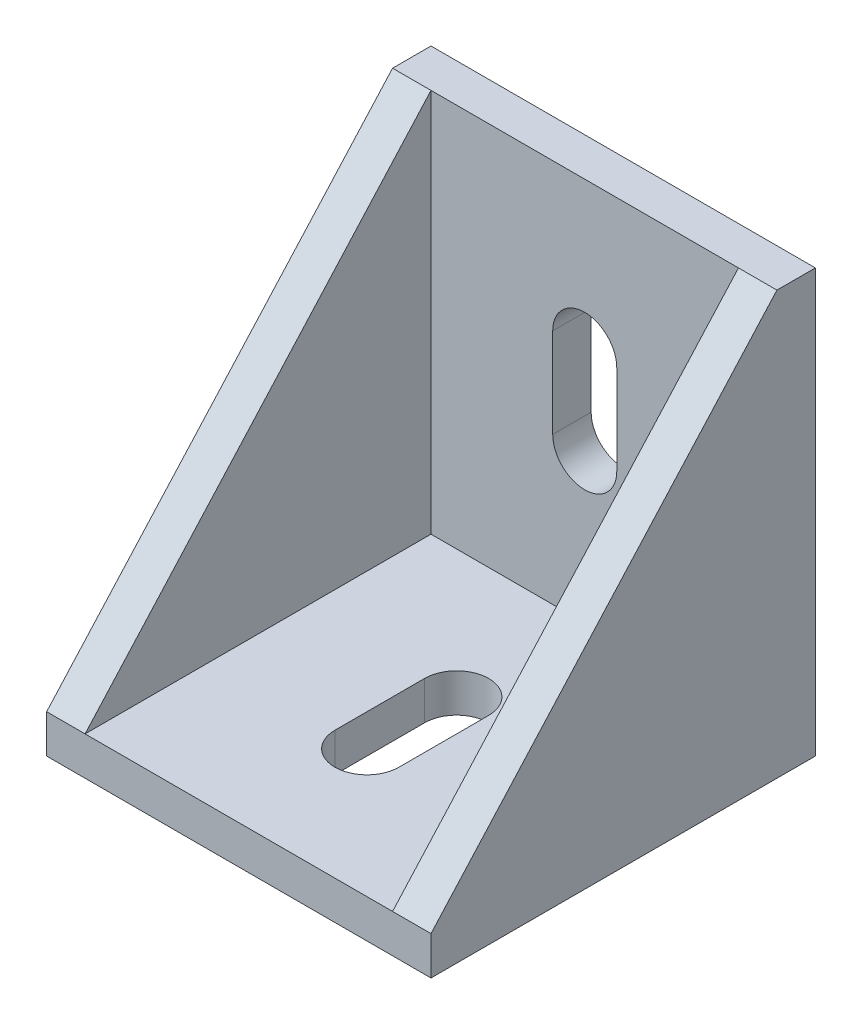
ISO-10303-21;
HEADER;
FILE_DESCRIPTION(('STEP AP214'),'2;1');
FILE_NAME('part.step','',(''),(''),'','','');
FILE_SCHEMA(('AUTOMOTIVE_DESIGN { 1 0 10303 214 1 1 1 1 }'));
ENDSEC;
DATA;
#1=APPLICATION_CONTEXT('core data for automotive mechanical design processes');
#2=APPLICATION_PROTOCOL_DEFINITION('international standard','automotive_design',2000,#1);
#3=PRODUCT_CONTEXT('',#1,'mechanical');
#4=PRODUCT('Part','Part','',(#3));
#5=PRODUCT_RELATED_PRODUCT_CATEGORY('part','',(#4));
#6=PRODUCT_DEFINITION_FORMATION('','',#4);
#7=PRODUCT_DEFINITION_CONTEXT('part definition',#1,'design');
#8=PRODUCT_DEFINITION('design','',#6,#7);
#9=PRODUCT_DEFINITION_SHAPE('','',#8);
#10=(LENGTH_UNIT() NAMED_UNIT(*) SI_UNIT(.MILLI.,.METRE.));
#11=(NAMED_UNIT(*) PLANE_ANGLE_UNIT() SI_UNIT($,.RADIAN.));
#12=(NAMED_UNIT(*) SI_UNIT($,.STERADIAN.) SOLID_ANGLE_UNIT());
#13=UNCERTAINTY_MEASURE_WITH_UNIT(LENGTH_MEASURE(1.E-05),#10,'distance_accuracy_value','');
#14=(GEOMETRIC_REPRESENTATION_CONTEXT(3) GLOBAL_UNCERTAINTY_ASSIGNED_CONTEXT((#13)) GLOBAL_UNIT_ASSIGNED_CONTEXT((#10,
#11,#12)) REPRESENTATION_CONTEXT('',''));
#15=CARTESIAN_POINT('',(0.,0.,0.));
#16=DIRECTION('',(0.,0.,1.));
#17=DIRECTION('',(1.,0.,0.));
#18=AXIS2_PLACEMENT_3D('',#15,#16,#17);
#19=CARTESIAN_POINT('',(0.,3.,30.));
#20=DIRECTION('',(1.,0.,0.));
#21=DIRECTION('',(0.,0.,-1.));
#22=AXIS2_PLACEMENT_3D('',#19,#20,#21);
#23=PLANE('',#22);
#24=DIRECTION('',(0.,-1.,0.));
#25=VECTOR('',#24,1.);
#26=CARTESIAN_POINT('',(0.,3.,30.));
#27=LINE('',#26,#25);
#28=CARTESIAN_POINT('',(0.,3.,30.));
#29=VERTEX_POINT('',#28);
#30=CARTESIAN_POINT('',(0.,0.,30.));
#31=VERTEX_POINT('',#30);
#32=EDGE_CURVE('E11',#29,#31,#27,.T.);
#33=ORIENTED_EDGE('',*,*,#32,.F.);
#34=DIRECTION('',(0.,0.743294146247166,-0.66896473162245));
#35=VECTOR('',#34,1.);
#36=CARTESIAN_POINT('',(0.,33.,3.));
#37=LINE('',#36,#35);
#38=CARTESIAN_POINT('',(0.,33.,3.));
#39=VERTEX_POINT('',#38);
#40=EDGE_CURVE('E229',#29,#39,#37,.T.);
#41=ORIENTED_EDGE('',*,*,#40,.T.);
#42=DIRECTION('',(0.,0.,-1.));
#43=VECTOR('',#42,1.);
#44=CARTESIAN_POINT('',(0.,33.,3.));
#45=LINE('',#44,#43);
#46=CARTESIAN_POINT('',(0.,33.,0.));
#47=VERTEX_POINT('',#46);
#48=EDGE_CURVE('E246',#39,#47,#45,.T.);
#49=ORIENTED_EDGE('',*,*,#48,.T.);
#50=DIRECTION('',(0.,-1.,0.));
#51=VECTOR('',#50,1.);
#52=CARTESIAN_POINT('',(0.,3.,0.));
#53=LINE('',#52,#51);
#54=CARTESIAN_POINT('',(0.,0.,0.));
#55=VERTEX_POINT('',#54);
#56=EDGE_CURVE('E258',#47,#55,#53,.T.);
#57=ORIENTED_EDGE('',*,*,#56,.T.);
#58=DIRECTION('',(0.,0.,1.));
#59=VECTOR('',#58,1.);
#60=CARTESIAN_POINT('',(0.,0.,30.));
#61=LINE('',#60,#59);
#62=EDGE_CURVE('E253',#55,#31,#61,.T.);
#63=ORIENTED_EDGE('',*,*,#62,.T.);
#64=EDGE_LOOP('',(#33,#41,#49,#57,#63));
#65=FACE_BOUND('',#64,.T.);
#66=ADVANCED_FACE('F33',(#65),#23,.F.);
#67=CARTESIAN_POINT('',(30.,3.,30.));
#68=DIRECTION('',(0.,0.,-1.));
#69=DIRECTION('',(-1.,0.,0.));
#70=AXIS2_PLACEMENT_3D('',#67,#68,#69);
#71=PLANE('',#70);
#72=DIRECTION('',(1.,0.,0.));
#73=VECTOR('',#72,1.);
#74=CARTESIAN_POINT('',(30.,0.,30.));
#75=LINE('',#74,#73);
#76=CARTESIAN_POINT('',(30.,0.,30.));
#77=VERTEX_POINT('',#76);
#78=EDGE_CURVE('E262',#31,#77,#75,.T.);
#79=ORIENTED_EDGE('',*,*,#78,.T.);
#80=DIRECTION('',(0.,-1.,0.));
#81=VECTOR('',#80,1.);
#82=CARTESIAN_POINT('',(30.,3.,30.));
#83=LINE('',#82,#81);
#84=CARTESIAN_POINT('',(30.,3.,30.));
#85=VERTEX_POINT('',#84);
#86=EDGE_CURVE('E42',#85,#77,#83,.T.);
#87=ORIENTED_EDGE('',*,*,#86,.F.);
#88=DIRECTION('',(1.,0.,0.));
#89=VECTOR('',#88,1.);
#90=CARTESIAN_POINT('',(27.,3.,30.));
#91=LINE('',#90,#89);
#92=CARTESIAN_POINT('',(27.,3.,30.));
#93=VERTEX_POINT('',#92);
#94=EDGE_CURVE('E227',#93,#85,#91,.T.);
#95=ORIENTED_EDGE('',*,*,#94,.F.);
#96=DIRECTION('',(1.,0.,0.));
#97=VECTOR('',#96,1.);
#98=CARTESIAN_POINT('',(30.,3.,30.));
#99=LINE('',#98,#97);
#100=CARTESIAN_POINT('',(3.,3.,30.));
#101=VERTEX_POINT('',#100);
#102=EDGE_CURVE('E259',#101,#93,#99,.T.);
#103=ORIENTED_EDGE('',*,*,#102,.F.);
#104=EDGE_CURVE('E256',#29,#101,#99,.T.);
#105=ORIENTED_EDGE('',*,*,#104,.F.);
#106=ORIENTED_EDGE('',*,*,#32,.T.);
#107=EDGE_LOOP('',(#79,#87,#95,#103,#105,#106));
#108=FACE_BOUND('',#107,.T.);
#109=ADVANCED_FACE('F315',(#108),#71,.F.);
#110=CARTESIAN_POINT('',(30.,3.,0.));
#111=DIRECTION('',(-1.,0.,0.));
#112=DIRECTION('',(0.,0.,1.));
#113=AXIS2_PLACEMENT_3D('',#110,#111,#112);
#114=PLANE('',#113);
#115=DIRECTION('',(0.,0.,-1.));
#116=VECTOR('',#115,1.);
#117=CARTESIAN_POINT('',(30.,0.,0.));
#118=LINE('',#117,#116);
#119=CARTESIAN_POINT('',(30.,0.,0.));
#120=VERTEX_POINT('',#119);
#121=EDGE_CURVE('E264',#77,#120,#118,.T.);
#122=ORIENTED_EDGE('',*,*,#121,.T.);
#123=DIRECTION('',(0.,-1.,0.));
#124=VECTOR('',#123,1.);
#125=CARTESIAN_POINT('',(30.,3.,0.));
#126=LINE('',#125,#124);
#127=CARTESIAN_POINT('',(30.,33.,0.));
#128=VERTEX_POINT('',#127);
#129=EDGE_CURVE('E270',#128,#120,#126,.T.);
#130=ORIENTED_EDGE('',*,*,#129,.F.);
#131=DIRECTION('',(0.,0.,-1.));
#132=VECTOR('',#131,1.);
#133=CARTESIAN_POINT('',(30.,33.,3.));
#134=LINE('',#133,#132);
#135=CARTESIAN_POINT('',(30.,33.,3.));
#136=VERTEX_POINT('',#135);
#137=EDGE_CURVE('E250',#136,#128,#134,.T.);
#138=ORIENTED_EDGE('',*,*,#137,.F.);
#139=DIRECTION('',(0.,-0.743294146247166,0.66896473162245));
#140=VECTOR('',#139,1.);
#141=CARTESIAN_POINT('',(30.,33.,3.));
#142=LINE('',#141,#140);
#143=EDGE_CURVE('E209',#136,#85,#142,.T.);
#144=ORIENTED_EDGE('',*,*,#143,.T.);
#145=ORIENTED_EDGE('',*,*,#86,.T.);
#146=EDGE_LOOP('',(#122,#130,#138,#144,#145));
#147=FACE_BOUND('',#146,.T.);
#148=ADVANCED_FACE('F277',(#147),#114,.F.);
#149=CARTESIAN_POINT('',(0.,3.,0.));
#150=DIRECTION('',(0.,0.,1.));
#151=DIRECTION('',(1.,0.,0.));
#152=AXIS2_PLACEMENT_3D('',#149,#150,#151);
#153=PLANE('',#152);
#154=DIRECTION('',(0.,-1.,0.));
#155=VECTOR('',#154,1.);
#156=CARTESIAN_POINT('',(12.5,14.5,0.));
#157=LINE('',#156,#155);
#158=CARTESIAN_POINT('',(12.5,21.5,0.));
#159=VERTEX_POINT('',#158);
#160=CARTESIAN_POINT('',(12.5,14.5,0.));
#161=VERTEX_POINT('',#160);
#162=EDGE_CURVE('E194',#159,#161,#157,.T.);
#163=ORIENTED_EDGE('',*,*,#162,.T.);
#164=CARTESIAN_POINT('',(15.,14.5,0.));
#165=DIRECTION('',(0.,0.,1.));
#166=DIRECTION('',(1.,0.,0.));
#167=AXIS2_PLACEMENT_3D('',#164,#165,#166);
#168=CIRCLE('',#167,2.5);
#169=CARTESIAN_POINT('',(17.5,14.5,0.));
#170=VERTEX_POINT('',#169);
#171=EDGE_CURVE('E184',#161,#170,#168,.T.);
#172=ORIENTED_EDGE('',*,*,#171,.T.);
#173=DIRECTION('',(0.,1.,0.));
#174=VECTOR('',#173,1.);
#175=CARTESIAN_POINT('',(17.5,14.5,0.));
#176=LINE('',#175,#174);
#177=CARTESIAN_POINT('',(17.5,21.5,0.));
#178=VERTEX_POINT('',#177);
#179=EDGE_CURVE('E187',#170,#178,#176,.T.);
#180=ORIENTED_EDGE('',*,*,#179,.T.);
#181=CARTESIAN_POINT('',(15.,21.5,0.));
#182=DIRECTION('',(0.,0.,1.));
#183=DIRECTION('',(1.,0.,0.));
#184=AXIS2_PLACEMENT_3D('',#181,#182,#183);
#185=CIRCLE('',#184,2.5);
#186=EDGE_CURVE('E191',#178,#159,#185,.T.);
#187=ORIENTED_EDGE('',*,*,#186,.T.);
#188=EDGE_LOOP('',(#163,#172,#180,#187));
#189=FACE_BOUND('',#188,.T.);
#190=DIRECTION('',(-1.,0.,0.));
#191=VECTOR('',#190,1.);
#192=CARTESIAN_POINT('',(0.,0.,0.));
#193=LINE('',#192,#191);
#194=EDGE_CURVE('E266',#120,#55,#193,.T.);
#195=ORIENTED_EDGE('',*,*,#194,.T.);
#196=ORIENTED_EDGE('',*,*,#56,.F.);
#197=DIRECTION('',(1.,0.,0.));
#198=VECTOR('',#197,1.);
#199=CARTESIAN_POINT('',(30.,33.,0.));
#200=LINE('',#199,#198);
#201=EDGE_CURVE('E240',#47,#128,#200,.T.);
#202=ORIENTED_EDGE('',*,*,#201,.T.);
#203=ORIENTED_EDGE('',*,*,#129,.T.);
#204=EDGE_LOOP('',(#195,#196,#202,#203));
#205=FACE_BOUND('',#204,.T.);
#206=ADVANCED_FACE('F284',(#189,#205),#153,.F.);
#207=CARTESIAN_POINT('',(0.,3.,0.));
#208=DIRECTION('',(0.,-1.,0.));
#209=DIRECTION('',(0.,0.,-1.));
#210=AXIS2_PLACEMENT_3D('',#207,#208,#209);
#211=PLANE('',#210);
#212=DIRECTION('',(0.,0.,-1.));
#213=VECTOR('',#212,1.);
#214=CARTESIAN_POINT('',(17.5,3.,20.));
#215=LINE('',#214,#213);
#216=CARTESIAN_POINT('',(17.5,3.,20.));
#217=VERTEX_POINT('',#216);
#218=CARTESIAN_POINT('',(17.5,3.,13.));
#219=VERTEX_POINT('',#218);
#220=EDGE_CURVE('E174',#217,#219,#215,.T.);
#221=ORIENTED_EDGE('',*,*,#220,.F.);
#222=CARTESIAN_POINT('',(15.,3.,20.));
#223=DIRECTION('',(0.,1.,0.));
#224=DIRECTION('',(0.,0.,1.));
#225=AXIS2_PLACEMENT_3D('',#222,#223,#224);
#226=CIRCLE('',#225,2.50000000000001);
#227=CARTESIAN_POINT('',(12.5,3.,20.));
#228=VERTEX_POINT('',#227);
#229=EDGE_CURVE('E49',#228,#217,#226,.T.);
#230=ORIENTED_EDGE('',*,*,#229,.F.);
#231=DIRECTION('',(0.,0.,1.));
#232=VECTOR('',#231,1.);
#233=CARTESIAN_POINT('',(12.5,3.,20.));
#234=LINE('',#233,#232);
#235=CARTESIAN_POINT('',(12.5,3.,13.));
#236=VERTEX_POINT('',#235);
#237=EDGE_CURVE('E165',#236,#228,#234,.T.);
#238=ORIENTED_EDGE('',*,*,#237,.F.);
#239=CARTESIAN_POINT('',(15.,3.,13.));
#240=DIRECTION('',(0.,1.,0.));
#241=DIRECTION('',(0.,0.,1.));
#242=AXIS2_PLACEMENT_3D('',#239,#240,#241);
#243=CIRCLE('',#242,2.5);
#244=EDGE_CURVE('E168',#219,#236,#243,.T.);
#245=ORIENTED_EDGE('',*,*,#244,.F.);
#246=EDGE_LOOP('',(#221,#230,#238,#245));
#247=FACE_BOUND('',#246,.T.);
#248=ORIENTED_EDGE('',*,*,#102,.T.);
#249=DIRECTION('',(0.,0.,-1.));
#250=VECTOR('',#249,1.);
#251=CARTESIAN_POINT('',(27.,3.,30.));
#252=LINE('',#251,#250);
#253=CARTESIAN_POINT('',(27.,3.,2.99999999999999));
#254=VERTEX_POINT('',#253);
#255=EDGE_CURVE('E221',#93,#254,#252,.T.);
#256=ORIENTED_EDGE('',*,*,#255,.T.);
#257=DIRECTION('',(-1.,0.,0.));
#258=VECTOR('',#257,1.);
#259=CARTESIAN_POINT('',(0.,3.,3.));
#260=LINE('',#259,#258);
#261=CARTESIAN_POINT('',(3.,3.,3.));
#262=VERTEX_POINT('',#261);
#263=EDGE_CURVE('E36',#254,#262,#260,.T.);
#264=ORIENTED_EDGE('',*,*,#263,.T.);
#265=DIRECTION('',(0.,0.,1.));
#266=VECTOR('',#265,1.);
#267=CARTESIAN_POINT('',(3.,3.,3.));
#268=LINE('',#267,#266);
#269=EDGE_CURVE('E232',#262,#101,#268,.T.);
#270=ORIENTED_EDGE('',*,*,#269,.T.);
#271=EDGE_LOOP('',(#248,#256,#264,#270));
#272=FACE_BOUND('',#271,.T.);
#273=ADVANCED_FACE('F307',(#247,#272),#211,.F.);
#274=CARTESIAN_POINT('',(0.,0.,0.));
#275=DIRECTION('',(0.,-1.,0.));
#276=DIRECTION('',(0.,0.,-1.));
#277=AXIS2_PLACEMENT_3D('',#274,#275,#276);
#278=PLANE('',#277);
#279=CARTESIAN_POINT('',(15.,0.,20.));
#280=DIRECTION('',(0.,1.,0.));
#281=DIRECTION('',(0.,0.,1.));
#282=AXIS2_PLACEMENT_3D('',#279,#280,#281);
#283=CIRCLE('',#282,2.50000000000001);
#284=CARTESIAN_POINT('',(12.5,0.,20.));
#285=VERTEX_POINT('',#284);
#286=CARTESIAN_POINT('',(17.5,0.,20.));
#287=VERTEX_POINT('',#286);
#288=EDGE_CURVE('E149',#285,#287,#283,.T.);
#289=ORIENTED_EDGE('',*,*,#288,.T.);
#290=DIRECTION('',(0.,0.,-1.));
#291=VECTOR('',#290,1.);
#292=CARTESIAN_POINT('',(17.5,0.,20.));
#293=LINE('',#292,#291);
#294=CARTESIAN_POINT('',(17.5,0.,13.));
#295=VERTEX_POINT('',#294);
#296=EDGE_CURVE('E158',#287,#295,#293,.T.);
#297=ORIENTED_EDGE('',*,*,#296,.T.);
#298=CARTESIAN_POINT('',(15.,0.,13.));
#299=DIRECTION('',(0.,1.,0.));
#300=DIRECTION('',(0.,0.,1.));
#301=AXIS2_PLACEMENT_3D('',#298,#299,#300);
#302=CIRCLE('',#301,2.5);
#303=CARTESIAN_POINT('',(12.5,0.,13.));
#304=VERTEX_POINT('',#303);
#305=EDGE_CURVE('E57',#295,#304,#302,.T.);
#306=ORIENTED_EDGE('',*,*,#305,.T.);
#307=DIRECTION('',(0.,0.,1.));
#308=VECTOR('',#307,1.);
#309=CARTESIAN_POINT('',(12.5,0.,20.));
#310=LINE('',#309,#308);
#311=EDGE_CURVE('E155',#304,#285,#310,.T.);
#312=ORIENTED_EDGE('',*,*,#311,.T.);
#313=EDGE_LOOP('',(#289,#297,#306,#312));
#314=FACE_BOUND('',#313,.T.);
#315=ORIENTED_EDGE('',*,*,#62,.F.);
#316=ORIENTED_EDGE('',*,*,#194,.F.);
#317=ORIENTED_EDGE('',*,*,#121,.F.);
#318=ORIENTED_EDGE('',*,*,#78,.F.);
#319=EDGE_LOOP('',(#315,#316,#317,#318));
#320=FACE_BOUND('',#319,.T.);
#321=ADVANCED_FACE('F162',(#314,#320),#278,.T.);
#322=CARTESIAN_POINT('',(30.,33.,3.));
#323=DIRECTION('',(0.,1.,0.));
#324=DIRECTION('',(0.,0.,1.));
#325=AXIS2_PLACEMENT_3D('',#322,#323,#324);
#326=PLANE('',#325);
#327=ORIENTED_EDGE('',*,*,#201,.F.);
#328=ORIENTED_EDGE('',*,*,#48,.F.);
#329=DIRECTION('',(1.,0.,0.));
#330=VECTOR('',#329,1.);
#331=CARTESIAN_POINT('',(30.,33.,3.));
#332=LINE('',#331,#330);
#333=CARTESIAN_POINT('',(3.,33.,3.));
#334=VERTEX_POINT('',#333);
#335=EDGE_CURVE('E243',#39,#334,#332,.T.);
#336=ORIENTED_EDGE('',*,*,#335,.T.);
#337=CARTESIAN_POINT('',(27.,33.,3.));
#338=VERTEX_POINT('',#337);
#339=EDGE_CURVE('E247',#334,#338,#332,.T.);
#340=ORIENTED_EDGE('',*,*,#339,.T.);
#341=DIRECTION('',(1.,0.,0.));
#342=VECTOR('',#341,1.);
#343=CARTESIAN_POINT('',(27.,33.,3.));
#344=LINE('',#343,#342);
#345=EDGE_CURVE('E224',#338,#136,#344,.T.);
#346=ORIENTED_EDGE('',*,*,#345,.T.);
#347=ORIENTED_EDGE('',*,*,#137,.T.);
#348=EDGE_LOOP('',(#327,#328,#336,#340,#346,#347));
#349=FACE_BOUND('',#348,.T.);
#350=ADVANCED_FACE('F291',(#349),#326,.T.);
#351=CARTESIAN_POINT('',(0.,0.,3.));
#352=DIRECTION('',(0.,0.,1.));
#353=DIRECTION('',(1.,0.,0.));
#354=AXIS2_PLACEMENT_3D('',#351,#352,#353);
#355=PLANE('',#354);
#356=CARTESIAN_POINT('',(15.,14.5,3.));
#357=DIRECTION('',(0.,0.,1.));
#358=DIRECTION('',(1.,0.,0.));
#359=AXIS2_PLACEMENT_3D('',#356,#357,#358);
#360=CIRCLE('',#359,2.5);
#361=CARTESIAN_POINT('',(12.5,14.5,3.));
#362=VERTEX_POINT('',#361);
#363=CARTESIAN_POINT('',(17.5,14.5,3.));
#364=VERTEX_POINT('',#363);
#365=EDGE_CURVE('E180',#362,#364,#360,.T.);
#366=ORIENTED_EDGE('',*,*,#365,.F.);
#367=DIRECTION('',(0.,-1.,0.));
#368=VECTOR('',#367,1.);
#369=CARTESIAN_POINT('',(12.5,14.5,3.));
#370=LINE('',#369,#368);
#371=CARTESIAN_POINT('',(12.5,21.5,3.));
#372=VERTEX_POINT('',#371);
#373=EDGE_CURVE('E188',#372,#362,#370,.T.);
#374=ORIENTED_EDGE('',*,*,#373,.F.);
#375=CARTESIAN_POINT('',(15.,21.5,3.));
#376=DIRECTION('',(0.,0.,1.));
#377=DIRECTION('',(1.,0.,0.));
#378=AXIS2_PLACEMENT_3D('',#375,#376,#377);
#379=CIRCLE('',#378,2.5);
#380=CARTESIAN_POINT('',(17.5,21.5,3.));
#381=VERTEX_POINT('',#380);
#382=EDGE_CURVE('E202',#381,#372,#379,.T.);
#383=ORIENTED_EDGE('',*,*,#382,.F.);
#384=DIRECTION('',(0.,1.,0.));
#385=VECTOR('',#384,1.);
#386=CARTESIAN_POINT('',(17.5,14.5,3.));
#387=LINE('',#386,#385);
#388=EDGE_CURVE('E199',#364,#381,#387,.T.);
#389=ORIENTED_EDGE('',*,*,#388,.F.);
#390=EDGE_LOOP('',(#366,#374,#383,#389));
#391=FACE_BOUND('',#390,.T.);
#392=DIRECTION('',(0.,1.,0.));
#393=VECTOR('',#392,1.);
#394=CARTESIAN_POINT('',(27.,3.,2.99999999999999));
#395=LINE('',#394,#393);
#396=EDGE_CURVE('E216',#254,#338,#395,.T.);
#397=ORIENTED_EDGE('',*,*,#396,.T.);
#398=ORIENTED_EDGE('',*,*,#339,.F.);
#399=DIRECTION('',(0.,-1.,0.));
#400=VECTOR('',#399,1.);
#401=CARTESIAN_POINT('',(3.,33.,3.));
#402=LINE('',#401,#400);
#403=EDGE_CURVE('E237',#334,#262,#402,.T.);
#404=ORIENTED_EDGE('',*,*,#403,.T.);
#405=ORIENTED_EDGE('',*,*,#263,.F.);
#406=EDGE_LOOP('',(#397,#398,#404,#405));
#407=FACE_BOUND('',#406,.T.);
#408=ADVANCED_FACE('F302',(#391,#407),#355,.T.);
#409=CARTESIAN_POINT('',(3.,33.,3.));
#410=DIRECTION('',(0.,0.66896473162245,0.743294146247166));
#411=DIRECTION('',(0.,-0.743294146247166,0.66896473162245));
#412=AXIS2_PLACEMENT_3D('',#409,#410,#411);
#413=PLANE('',#412);
#414=ORIENTED_EDGE('',*,*,#40,.F.);
#415=ORIENTED_EDGE('',*,*,#104,.T.);
#416=DIRECTION('',(0.,0.743294146247166,-0.66896473162245));
#417=VECTOR('',#416,1.);
#418=CARTESIAN_POINT('',(3.,33.,3.));
#419=LINE('',#418,#417);
#420=EDGE_CURVE('E235',#101,#334,#419,.T.);
#421=ORIENTED_EDGE('',*,*,#420,.T.);
#422=ORIENTED_EDGE('',*,*,#335,.F.);
#423=EDGE_LOOP('',(#414,#415,#421,#422));
#424=FACE_BOUND('',#423,.T.);
#425=ADVANCED_FACE('F313',(#424),#413,.T.);
#426=CARTESIAN_POINT('',(3.,0.,0.));
#427=DIRECTION('',(1.,0.,0.));
#428=DIRECTION('',(0.,0.,-1.));
#429=AXIS2_PLACEMENT_3D('',#426,#427,#428);
#430=PLANE('',#429);
#431=ORIENTED_EDGE('',*,*,#269,.F.);
#432=ORIENTED_EDGE('',*,*,#403,.F.);
#433=ORIENTED_EDGE('',*,*,#420,.F.);
#434=EDGE_LOOP('',(#431,#432,#433));
#435=FACE_BOUND('',#434,.T.);
#436=ADVANCED_FACE('F311',(#435),#430,.T.);
#437=CARTESIAN_POINT('',(27.,33.,3.));
#438=DIRECTION('',(0.,0.66896473162245,0.743294146247166));
#439=DIRECTION('',(0.,-0.743294146247166,0.66896473162245));
#440=AXIS2_PLACEMENT_3D('',#437,#438,#439);
#441=PLANE('',#440);
#442=ORIENTED_EDGE('',*,*,#143,.F.);
#443=ORIENTED_EDGE('',*,*,#345,.F.);
#444=DIRECTION('',(0.,-0.743294146247166,0.66896473162245));
#445=VECTOR('',#444,1.);
#446=CARTESIAN_POINT('',(27.,33.,3.));
#447=LINE('',#446,#445);
#448=EDGE_CURVE('E219',#338,#93,#447,.T.);
#449=ORIENTED_EDGE('',*,*,#448,.T.);
#450=ORIENTED_EDGE('',*,*,#94,.T.);
#451=EDGE_LOOP('',(#442,#443,#449,#450));
#452=FACE_BOUND('',#451,.T.);
#453=ADVANCED_FACE('F296',(#452),#441,.T.);
#454=CARTESIAN_POINT('',(27.,0.,0.));
#455=DIRECTION('',(-1.,0.,0.));
#456=DIRECTION('',(0.,0.,1.));
#457=AXIS2_PLACEMENT_3D('',#454,#455,#456);
#458=PLANE('',#457);
#459=ORIENTED_EDGE('',*,*,#396,.F.);
#460=ORIENTED_EDGE('',*,*,#255,.F.);
#461=ORIENTED_EDGE('',*,*,#448,.F.);
#462=EDGE_LOOP('',(#459,#460,#461));
#463=FACE_BOUND('',#462,.T.);
#464=ADVANCED_FACE('F299',(#463),#458,.T.);
#465=CARTESIAN_POINT('',(15.,14.5,0.));
#466=DIRECTION('',(0.,0.,1.));
#467=DIRECTION('',(1.,0.,0.));
#468=AXIS2_PLACEMENT_3D('',#465,#466,#467);
#469=CYLINDRICAL_SURFACE('',#468,2.5);
#470=ORIENTED_EDGE('',*,*,#365,.T.);
#471=DIRECTION('',(0.,0.,1.));
#472=VECTOR('',#471,1.);
#473=CARTESIAN_POINT('',(17.5,14.5,0.));
#474=LINE('',#473,#472);
#475=EDGE_CURVE('E197',#170,#364,#474,.T.);
#476=ORIENTED_EDGE('',*,*,#475,.F.);
#477=ORIENTED_EDGE('',*,*,#171,.F.);
#478=DIRECTION('',(0.,0.,1.));
#479=VECTOR('',#478,1.);
#480=CARTESIAN_POINT('',(12.5,14.5,0.));
#481=LINE('',#480,#479);
#482=EDGE_CURVE('E207',#161,#362,#481,.T.);
#483=ORIENTED_EDGE('',*,*,#482,.T.);
#484=EDGE_LOOP('',(#470,#476,#477,#483));
#485=FACE_BOUND('',#484,.T.);
#486=ADVANCED_FACE('F344',(#485),#469,.F.);
#487=CARTESIAN_POINT('',(12.5,14.5,0.));
#488=DIRECTION('',(-1.,0.,0.));
#489=DIRECTION('',(0.,-1.,0.));
#490=AXIS2_PLACEMENT_3D('',#487,#488,#489);
#491=PLANE('',#490);
#492=ORIENTED_EDGE('',*,*,#373,.T.);
#493=ORIENTED_EDGE('',*,*,#482,.F.);
#494=ORIENTED_EDGE('',*,*,#162,.F.);
#495=DIRECTION('',(0.,0.,1.));
#496=VECTOR('',#495,1.);
#497=CARTESIAN_POINT('',(12.5,21.5,0.));
#498=LINE('',#497,#496);
#499=EDGE_CURVE('E210',#159,#372,#498,.T.);
#500=ORIENTED_EDGE('',*,*,#499,.T.);
#501=EDGE_LOOP('',(#492,#493,#494,#500));
#502=FACE_BOUND('',#501,.T.);
#503=ADVANCED_FACE('F347',(#502),#491,.F.);
#504=CARTESIAN_POINT('',(15.,21.5,0.));
#505=DIRECTION('',(0.,0.,1.));
#506=DIRECTION('',(1.,0.,0.));
#507=AXIS2_PLACEMENT_3D('',#504,#505,#506);
#508=CYLINDRICAL_SURFACE('',#507,2.5);
#509=ORIENTED_EDGE('',*,*,#382,.T.);
#510=ORIENTED_EDGE('',*,*,#499,.F.);
#511=ORIENTED_EDGE('',*,*,#186,.F.);
#512=DIRECTION('',(0.,0.,1.));
#513=VECTOR('',#512,1.);
#514=CARTESIAN_POINT('',(17.5,21.5,0.));
#515=LINE('',#514,#513);
#516=EDGE_CURVE('E212',#178,#381,#515,.T.);
#517=ORIENTED_EDGE('',*,*,#516,.T.);
#518=EDGE_LOOP('',(#509,#510,#511,#517));
#519=FACE_BOUND('',#518,.T.);
#520=ADVANCED_FACE('F352',(#519),#508,.F.);
#521=CARTESIAN_POINT('',(17.5,14.5,0.));
#522=DIRECTION('',(1.,0.,0.));
#523=DIRECTION('',(0.,1.,0.));
#524=AXIS2_PLACEMENT_3D('',#521,#522,#523);
#525=PLANE('',#524);
#526=ORIENTED_EDGE('',*,*,#388,.T.);
#527=ORIENTED_EDGE('',*,*,#516,.F.);
#528=ORIENTED_EDGE('',*,*,#179,.F.);
#529=ORIENTED_EDGE('',*,*,#475,.T.);
#530=EDGE_LOOP('',(#526,#527,#528,#529));
#531=FACE_BOUND('',#530,.T.);
#532=ADVANCED_FACE('F349',(#531),#525,.F.);
#533=CARTESIAN_POINT('',(15.,0.,20.));
#534=DIRECTION('',(0.,1.,0.));
#535=DIRECTION('',(0.,0.,1.));
#536=AXIS2_PLACEMENT_3D('',#533,#534,#535);
#537=CYLINDRICAL_SURFACE('',#536,2.50000000000001);
#538=ORIENTED_EDGE('',*,*,#229,.T.);
#539=DIRECTION('',(0.,1.,0.));
#540=VECTOR('',#539,1.);
#541=CARTESIAN_POINT('',(17.5,0.,20.));
#542=LINE('',#541,#540);
#543=EDGE_CURVE('E145',#287,#217,#542,.T.);
#544=ORIENTED_EDGE('',*,*,#543,.F.);
#545=ORIENTED_EDGE('',*,*,#288,.F.);
#546=DIRECTION('',(0.,1.,0.));
#547=VECTOR('',#546,1.);
#548=CARTESIAN_POINT('',(12.5,0.,20.));
#549=LINE('',#548,#547);
#550=EDGE_CURVE('E178',#285,#228,#549,.T.);
#551=ORIENTED_EDGE('',*,*,#550,.T.);
#552=EDGE_LOOP('',(#538,#544,#545,#551));
#553=FACE_BOUND('',#552,.T.);
#554=ADVANCED_FACE('F147',(#553),#537,.F.);
#555=CARTESIAN_POINT('',(12.5,0.,20.));
#556=DIRECTION('',(-1.,0.,0.));
#557=DIRECTION('',(0.,0.,1.));
#558=AXIS2_PLACEMENT_3D('',#555,#556,#557);
#559=PLANE('',#558);
#560=ORIENTED_EDGE('',*,*,#237,.T.);
#561=ORIENTED_EDGE('',*,*,#550,.F.);
#562=ORIENTED_EDGE('',*,*,#311,.F.);
#563=DIRECTION('',(0.,1.,0.));
#564=VECTOR('',#563,1.);
#565=CARTESIAN_POINT('',(12.5,0.,13.));
#566=LINE('',#565,#564);
#567=EDGE_CURVE('E181',#304,#236,#566,.T.);
#568=ORIENTED_EDGE('',*,*,#567,.T.);
#569=EDGE_LOOP('',(#560,#561,#562,#568));
#570=FACE_BOUND('',#569,.T.);
#571=ADVANCED_FACE('F362',(#570),#559,.F.);
#572=CARTESIAN_POINT('',(15.,0.,13.));
#573=DIRECTION('',(0.,1.,0.));
#574=DIRECTION('',(0.,0.,1.));
#575=AXIS2_PLACEMENT_3D('',#572,#573,#574);
#576=CYLINDRICAL_SURFACE('',#575,2.5);
#577=ORIENTED_EDGE('',*,*,#244,.T.);
#578=ORIENTED_EDGE('',*,*,#567,.F.);
#579=ORIENTED_EDGE('',*,*,#305,.F.);
#580=DIRECTION('',(0.,1.,0.));
#581=VECTOR('',#580,1.);
#582=CARTESIAN_POINT('',(17.5,0.,13.));
#583=LINE('',#582,#581);
#584=EDGE_CURVE('E154',#295,#219,#583,.T.);
#585=ORIENTED_EDGE('',*,*,#584,.T.);
#586=EDGE_LOOP('',(#577,#578,#579,#585));
#587=FACE_BOUND('',#586,.T.);
#588=ADVANCED_FACE('F365',(#587),#576,.F.);
#589=CARTESIAN_POINT('',(17.5,0.,20.));
#590=DIRECTION('',(1.,0.,0.));
#591=DIRECTION('',(0.,0.,-1.));
#592=AXIS2_PLACEMENT_3D('',#589,#590,#591);
#593=PLANE('',#592);
#594=ORIENTED_EDGE('',*,*,#220,.T.);
#595=ORIENTED_EDGE('',*,*,#584,.F.);
#596=ORIENTED_EDGE('',*,*,#296,.F.);
#597=ORIENTED_EDGE('',*,*,#543,.T.);
#598=EDGE_LOOP('',(#594,#595,#596,#597));
#599=FACE_BOUND('',#598,.T.);
#600=ADVANCED_FACE('F159',(#599),#593,.F.);
#601=CLOSED_SHELL('',(#66,#109,#148,#206,#273,#321,#350,#408,#425,#436,#453,#464,#486,#503,#520,
#532,#554,#571,#588,#600));
#602=MANIFOLD_SOLID_BREP('B2',#601);
#603=ADVANCED_BREP_SHAPE_REPRESENTATION('',(#18,#602),#14);
#604=SHAPE_DEFINITION_REPRESENTATION(#9,#603);
ENDSEC;
END-ISO-10303-21;
